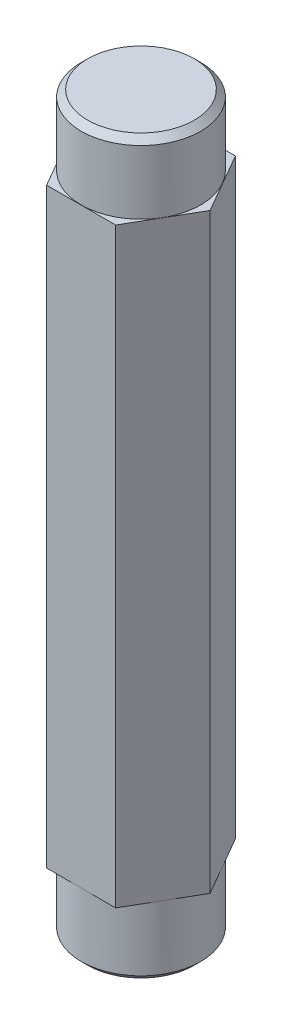
ISO-10303-21;
HEADER;
FILE_DESCRIPTION(('STEP AP214'),'2;1');
FILE_NAME('part.step','',(''),(''),'','','');
FILE_SCHEMA(('AUTOMOTIVE_DESIGN { 1 0 10303 214 1 1 1 1 }'));
ENDSEC;
DATA;
#1=APPLICATION_CONTEXT('core data for automotive mechanical design processes');
#2=APPLICATION_PROTOCOL_DEFINITION('international standard','automotive_design',2000,#1);
#3=PRODUCT_CONTEXT('',#1,'mechanical');
#4=PRODUCT('Part','Part','',(#3));
#5=PRODUCT_RELATED_PRODUCT_CATEGORY('part','',(#4));
#6=PRODUCT_DEFINITION_FORMATION('','',#4);
#7=PRODUCT_DEFINITION_CONTEXT('part definition',#1,'design');
#8=PRODUCT_DEFINITION('design','',#6,#7);
#9=PRODUCT_DEFINITION_SHAPE('','',#8);
#10=(LENGTH_UNIT() NAMED_UNIT(*) SI_UNIT(.MILLI.,.METRE.));
#11=(NAMED_UNIT(*) PLANE_ANGLE_UNIT() SI_UNIT($,.RADIAN.));
#12=(NAMED_UNIT(*) SI_UNIT($,.STERADIAN.) SOLID_ANGLE_UNIT());
#13=UNCERTAINTY_MEASURE_WITH_UNIT(LENGTH_MEASURE(1.E-05),#10,'distance_accuracy_value','');
#14=(GEOMETRIC_REPRESENTATION_CONTEXT(3) GLOBAL_UNCERTAINTY_ASSIGNED_CONTEXT((#13)) GLOBAL_UNIT_ASSIGNED_CONTEXT((#10,
#11,#12)) REPRESENTATION_CONTEXT('',''));
#15=CARTESIAN_POINT('',(0.,0.,0.));
#16=DIRECTION('',(0.,0.,1.));
#17=DIRECTION('',(1.,0.,0.));
#18=AXIS2_PLACEMENT_3D('',#15,#16,#17);
#19=CARTESIAN_POINT('',(-39.2241243202131,5.588,-16.6661167863655));
#20=DIRECTION('',(0.,-1.,0.));
#21=DIRECTION('',(0.,0.,-1.));
#22=AXIS2_PLACEMENT_3D('',#19,#20,#21);
#23=PLANE('',#22);
#24=CARTESIAN_POINT('',(-39.2241243202131,5.58799999998882,-16.6661167863655));
#25=DIRECTION('',(0.,-1.,0.));
#26=DIRECTION('',(0.,0.,-1.));
#27=AXIS2_PLACEMENT_3D('',#24,#25,#26);
#28=CIRCLE('',#27,4.24180000006195);
#29=CARTESIAN_POINT('',(-39.2241243202131,5.58799999998882,-20.9079167864274));
#30=VERTEX_POINT('',#29);
#31=EDGE_CURVE('E19',#30,#30,#28,.T.);
#32=ORIENTED_EDGE('',*,*,#31,.F.);
#33=EDGE_LOOP('',(#32));
#34=FACE_BOUND('',#33,.T.);
#35=ADVANCED_FACE('F16',(#34),#23,.F.);
#36=CARTESIAN_POINT('',(-39.2241243202131,-52.6542,-16.6661167863655));
#37=DIRECTION('',(0.,1.,0.));
#38=DIRECTION('',(0.,0.,1.));
#39=AXIS2_PLACEMENT_3D('',#36,#37,#38);
#40=PLANE('',#39);
#41=CARTESIAN_POINT('',(-39.2241243202131,-52.6542000000632,-16.6661167863655));
#42=DIRECTION('',(0.,1.,0.));
#43=DIRECTION('',(0.,0.,1.));
#44=AXIS2_PLACEMENT_3D('',#41,#42,#43);
#45=CIRCLE('',#44,4.24179999997172);
#46=CARTESIAN_POINT('',(-39.2241243202131,-52.6542000000632,-12.4243167863938));
#47=VERTEX_POINT('',#46);
#48=EDGE_CURVE('E106',#47,#47,#45,.T.);
#49=ORIENTED_EDGE('',*,*,#48,.F.);
#50=EDGE_LOOP('',(#49));
#51=FACE_BOUND('',#50,.T.);
#52=ADVANCED_FACE('F123',(#51),#40,.F.);
#53=CARTESIAN_POINT('',(-39.2241243202131,5.08000000002085,-16.6661167863655));
#54=DIRECTION('',(0.,-1.,0.));
#55=DIRECTION('',(0.,0.,-1.));
#56=AXIS2_PLACEMENT_3D('',#53,#54,#55);
#57=CONICAL_SURFACE('',#56,4.74980000002993,0.785398163397448);
#58=CARTESIAN_POINT('',(-39.2241243202131,5.08,-16.6661167863655));
#59=DIRECTION('',(0.,1.,0.));
#60=DIRECTION('',(0.,0.,1.));
#61=AXIS2_PLACEMENT_3D('',#58,#59,#60);
#62=CIRCLE('',#61,4.7498);
#63=CARTESIAN_POINT('',(-39.2241243202131,5.08,-11.9163167863655));
#64=VERTEX_POINT('',#63);
#65=EDGE_CURVE('E101',#64,#64,#62,.F.);
#66=ORIENTED_EDGE('',*,*,#65,.F.);
#67=EDGE_LOOP('',(#66));
#68=FACE_BOUND('',#67,.T.);
#69=ORIENTED_EDGE('',*,*,#31,.T.);
#70=EDGE_LOOP('',(#69));
#71=FACE_BOUND('',#70,.T.);
#72=ADVANCED_FACE('F120',(#68,#71),#57,.T.);
#73=CARTESIAN_POINT('',(-39.2241243202131,-52.1461999999815,-16.6661167863655));
#74=DIRECTION('',(0.,1.,0.));
#75=DIRECTION('',(0.,0.,1.));
#76=AXIS2_PLACEMENT_3D('',#73,#74,#75);
#77=CONICAL_SURFACE('',#76,4.74980000005339,0.785398163397448);
#78=CARTESIAN_POINT('',(-39.2241243202131,-52.1462,-16.6661167863655));
#79=DIRECTION('',(0.,-1.,0.));
#80=DIRECTION('',(0.,0.,-1.));
#81=AXIS2_PLACEMENT_3D('',#78,#79,#80);
#82=CIRCLE('',#81,4.7498);
#83=CARTESIAN_POINT('',(-39.2241243202131,-52.1462,-21.4159167863655));
#84=VERTEX_POINT('',#83);
#85=EDGE_CURVE('E86',#84,#84,#82,.F.);
#86=ORIENTED_EDGE('',*,*,#85,.F.);
#87=EDGE_LOOP('',(#86));
#88=FACE_BOUND('',#87,.T.);
#89=ORIENTED_EDGE('',*,*,#48,.T.);
#90=EDGE_LOOP('',(#89));
#91=FACE_BOUND('',#90,.T.);
#92=ADVANCED_FACE('F165',(#88,#91),#77,.T.);
#93=CARTESIAN_POINT('',(-39.2241243202131,5.588,-16.6661167863655));
#94=DIRECTION('',(0.,1.,0.));
#95=DIRECTION('',(0.,0.,1.));
#96=AXIS2_PLACEMENT_3D('',#93,#94,#95);
#97=CYLINDRICAL_SURFACE('',#96,4.7498);
#98=CARTESIAN_POINT('',(-39.2241243202131,0.,-16.6661167863655));
#99=DIRECTION('',(0.,1.,0.));
#100=DIRECTION('',(0.,0.,1.));
#101=AXIS2_PLACEMENT_3D('',#98,#99,#100);
#102=CIRCLE('',#101,4.7498);
#103=CARTESIAN_POINT('',(-39.2241243202131,0.,-11.9163167863655));
#104=VERTEX_POINT('',#103);
#105=EDGE_CURVE('E79',#104,#104,#102,.T.);
#106=ORIENTED_EDGE('',*,*,#105,.T.);
#107=EDGE_LOOP('',(#106));
#108=FACE_BOUND('',#107,.T.);
#109=ORIENTED_EDGE('',*,*,#65,.T.);
#110=EDGE_LOOP('',(#109));
#111=FACE_BOUND('',#110,.T.);
#112=ADVANCED_FACE('F161',(#108,#111),#97,.T.);
#113=CARTESIAN_POINT('',(-39.2241243202131,-52.6542,-16.6661167863655));
#114=DIRECTION('',(0.,-1.,0.));
#115=DIRECTION('',(0.,0.,-1.));
#116=AXIS2_PLACEMENT_3D('',#113,#114,#115);
#117=CYLINDRICAL_SURFACE('',#116,4.7498);
#118=CARTESIAN_POINT('',(-39.2241243202131,-47.0662,-16.6661167863655));
#119=DIRECTION('',(0.,-1.,0.));
#120=DIRECTION('',(0.,0.,-1.));
#121=AXIS2_PLACEMENT_3D('',#118,#119,#120);
#122=CIRCLE('',#121,4.7498);
#123=CARTESIAN_POINT('',(-39.2241243202131,-47.0662,-21.4159167863655));
#124=VERTEX_POINT('',#123);
#125=EDGE_CURVE('E109',#124,#124,#122,.F.);
#126=ORIENTED_EDGE('',*,*,#125,.F.);
#127=EDGE_LOOP('',(#126));
#128=FACE_BOUND('',#127,.T.);
#129=ORIENTED_EDGE('',*,*,#85,.T.);
#130=EDGE_LOOP('',(#129));
#131=FACE_BOUND('',#130,.T.);
#132=ADVANCED_FACE('F158',(#128,#131),#117,.T.);
#133=CARTESIAN_POINT('',(-41.9737549772287,-47.0662,-21.4286167863655));
#134=DIRECTION('',(-0.866025403784438,0.,-0.500000000000001));
#135=DIRECTION('',(-0.500000000000001,0.,0.866025403784438));
#136=AXIS2_PLACEMENT_3D('',#133,#134,#135);
#137=PLANE('',#136);
#138=DIRECTION('',(0.500000000000001,0.,-0.866025403784438));
#139=VECTOR('',#138,1.);
#140=CARTESIAN_POINT('',(-44.7233856342443,-47.0662,-16.6661167863655));
#141=LINE('',#140,#139);
#142=CARTESIAN_POINT('',(-44.7233856342443,-47.0662,-16.6661167863655));
#143=VERTEX_POINT('',#142);
#144=CARTESIAN_POINT('',(-41.9737549772287,-47.0662,-21.4286167863655));
#145=VERTEX_POINT('',#144);
#146=EDGE_CURVE('E244',#143,#145,#141,.T.);
#147=ORIENTED_EDGE('',*,*,#146,.F.);
#148=DIRECTION('',(0.,1.,0.));
#149=VECTOR('',#148,1.);
#150=CARTESIAN_POINT('',(-44.7233856342443,-47.0662,-16.6661167863655));
#151=LINE('',#150,#149);
#152=CARTESIAN_POINT('',(-44.7233856342443,0.,-16.6661167863655));
#153=VERTEX_POINT('',#152);
#154=EDGE_CURVE('E76',#153,#143,#151,.F.);
#155=ORIENTED_EDGE('',*,*,#154,.F.);
#156=DIRECTION('',(0.500000000000001,0.,-0.866025403784438));
#157=VECTOR('',#156,1.);
#158=CARTESIAN_POINT('',(-44.7233856342443,0.,-16.6661167863655));
#159=LINE('',#158,#157);
#160=CARTESIAN_POINT('',(-41.9737549772287,0.,-21.4286167863655));
#161=VERTEX_POINT('',#160);
#162=EDGE_CURVE('E71',#153,#161,#159,.T.);
#163=ORIENTED_EDGE('',*,*,#162,.T.);
#164=DIRECTION('',(0.,1.,0.));
#165=VECTOR('',#164,1.);
#166=CARTESIAN_POINT('',(-41.9737549772287,-47.0662,-21.4286167863655));
#167=LINE('',#166,#165);
#168=EDGE_CURVE('E74',#145,#161,#167,.T.);
#169=ORIENTED_EDGE('',*,*,#168,.F.);
#170=EDGE_LOOP('',(#147,#155,#163,#169));
#171=FACE_BOUND('',#170,.T.);
#172=ADVANCED_FACE('F73',(#171),#137,.T.);
#173=CARTESIAN_POINT('',(-36.4744936631975,-47.0662,-21.4286167863655));
#174=DIRECTION('',(0.,0.,-1.));
#175=DIRECTION('',(-1.,0.,0.));
#176=AXIS2_PLACEMENT_3D('',#173,#174,#175);
#177=PLANE('',#176);
#178=DIRECTION('',(1.,0.,0.));
#179=VECTOR('',#178,1.);
#180=CARTESIAN_POINT('',(-44.7233856342443,-47.0662,-21.4286167863655));
#181=LINE('',#180,#179);
#182=CARTESIAN_POINT('',(-36.4744936631975,-47.0662,-21.4286167863655));
#183=VERTEX_POINT('',#182);
#184=EDGE_CURVE('E83',#145,#183,#181,.T.);
#185=ORIENTED_EDGE('',*,*,#184,.F.);
#186=ORIENTED_EDGE('',*,*,#168,.T.);
#187=DIRECTION('',(1.,0.,0.));
#188=VECTOR('',#187,1.);
#189=CARTESIAN_POINT('',(-44.7233856342443,0.,-21.4286167863655));
#190=LINE('',#189,#188);
#191=CARTESIAN_POINT('',(-36.4744936631975,0.,-21.4286167863655));
#192=VERTEX_POINT('',#191);
#193=EDGE_CURVE('E66',#161,#192,#190,.T.);
#194=ORIENTED_EDGE('',*,*,#193,.T.);
#195=DIRECTION('',(0.,1.,0.));
#196=VECTOR('',#195,1.);
#197=CARTESIAN_POINT('',(-36.4744936631975,-47.0662,-21.4286167863655));
#198=LINE('',#197,#196);
#199=EDGE_CURVE('E85',#183,#192,#198,.T.);
#200=ORIENTED_EDGE('',*,*,#199,.F.);
#201=EDGE_LOOP('',(#185,#186,#194,#200));
#202=FACE_BOUND('',#201,.T.);
#203=ADVANCED_FACE('F81',(#202),#177,.T.);
#204=CARTESIAN_POINT('',(-33.7248630061819,-47.0662,-16.6661167863655));
#205=DIRECTION('',(0.866025403784439,0.,-0.5));
#206=DIRECTION('',(-0.5,0.,-0.866025403784439));
#207=AXIS2_PLACEMENT_3D('',#204,#205,#206);
#208=PLANE('',#207);
#209=DIRECTION('',(0.500000000000002,0.,0.866025403784438));
#210=VECTOR('',#209,1.);
#211=CARTESIAN_POINT('',(-36.4744936631975,-47.0662,-21.4286167863655));
#212=LINE('',#211,#210);
#213=CARTESIAN_POINT('',(-33.7248630061819,-47.0662,-16.6661167863655));
#214=VERTEX_POINT('',#213);
#215=EDGE_CURVE('E238',#183,#214,#212,.T.);
#216=ORIENTED_EDGE('',*,*,#215,.F.);
#217=ORIENTED_EDGE('',*,*,#199,.T.);
#218=DIRECTION('',(0.500000000000002,0.,0.866025403784438));
#219=VECTOR('',#218,1.);
#220=CARTESIAN_POINT('',(-36.4744936631975,0.,-21.4286167863655));
#221=LINE('',#220,#219);
#222=CARTESIAN_POINT('',(-33.7248630061819,0.,-16.6661167863655));
#223=VERTEX_POINT('',#222);
#224=EDGE_CURVE('E92',#192,#223,#221,.T.);
#225=ORIENTED_EDGE('',*,*,#224,.T.);
#226=DIRECTION('',(0.,1.,0.));
#227=VECTOR('',#226,1.);
#228=CARTESIAN_POINT('',(-33.7248630061819,-47.0662,-16.6661167863655));
#229=LINE('',#228,#227);
#230=EDGE_CURVE('E240',#214,#223,#229,.T.);
#231=ORIENTED_EDGE('',*,*,#230,.F.);
#232=EDGE_LOOP('',(#216,#217,#225,#231));
#233=FACE_BOUND('',#232,.T.);
#234=ADVANCED_FACE('F150',(#233),#208,.T.);
#235=CARTESIAN_POINT('',(-44.7233856342443,0.,-16.6661167863655));
#236=DIRECTION('',(0.,-1.,0.));
#237=DIRECTION('',(0.,0.,-1.));
#238=AXIS2_PLACEMENT_3D('',#235,#236,#237);
#239=PLANE('',#238);
#240=DIRECTION('',(1.,0.,0.));
#241=VECTOR('',#240,1.);
#242=CARTESIAN_POINT('',(-41.9737549772287,0.,-11.9036167863655));
#243=LINE('',#242,#241);
#244=CARTESIAN_POINT('',(-36.4744936631975,0.,-11.9036167863655));
#245=VERTEX_POINT('',#244);
#246=CARTESIAN_POINT('',(-41.9737549772287,0.,-11.9036167863655));
#247=VERTEX_POINT('',#246);
#248=EDGE_CURVE('E254',#245,#247,#243,.F.);
#249=ORIENTED_EDGE('',*,*,#248,.F.);
#250=DIRECTION('',(0.500000000000001,0.,-0.866025403784438));
#251=VECTOR('',#250,1.);
#252=CARTESIAN_POINT('',(-36.4744936631975,0.,-11.9036167863655));
#253=LINE('',#252,#251);
#254=EDGE_CURVE('E241',#223,#245,#253,.F.);
#255=ORIENTED_EDGE('',*,*,#254,.F.);
#256=ORIENTED_EDGE('',*,*,#224,.F.);
#257=ORIENTED_EDGE('',*,*,#193,.F.);
#258=ORIENTED_EDGE('',*,*,#162,.F.);
#259=DIRECTION('',(0.5,0.,0.866025403784439));
#260=VECTOR('',#259,1.);
#261=CARTESIAN_POINT('',(-44.7233856342443,0.,-16.6661167863655));
#262=LINE('',#261,#260);
#263=EDGE_CURVE('E94',#247,#153,#262,.F.);
#264=ORIENTED_EDGE('',*,*,#263,.F.);
#265=EDGE_LOOP('',(#249,#255,#256,#257,#258,#264));
#266=FACE_BOUND('',#265,.T.);
#267=ORIENTED_EDGE('',*,*,#105,.F.);
#268=EDGE_LOOP('',(#267));
#269=FACE_BOUND('',#268,.T.);
#270=ADVANCED_FACE('F89',(#266,#269),#239,.F.);
#271=CARTESIAN_POINT('',(-44.7233856342443,-47.0662,-16.6661167863655));
#272=DIRECTION('',(-0.866025403784439,0.,0.5));
#273=DIRECTION('',(0.5,0.,0.866025403784439));
#274=AXIS2_PLACEMENT_3D('',#271,#272,#273);
#275=PLANE('',#274);
#276=DIRECTION('',(-0.500000000000001,0.,-0.866025403784438));
#277=VECTOR('',#276,1.);
#278=CARTESIAN_POINT('',(-41.9737549772287,-47.0662,-11.9036167863655));
#279=LINE('',#278,#277);
#280=CARTESIAN_POINT('',(-41.9737549772287,-47.0662,-11.9036167863655));
#281=VERTEX_POINT('',#280);
#282=EDGE_CURVE('E112',#281,#143,#279,.T.);
#283=ORIENTED_EDGE('',*,*,#282,.F.);
#284=DIRECTION('',(0.,1.,0.));
#285=VECTOR('',#284,1.);
#286=CARTESIAN_POINT('',(-41.9737549772287,-47.0662,-11.9036167863655));
#287=LINE('',#286,#285);
#288=EDGE_CURVE('E252',#247,#281,#287,.F.);
#289=ORIENTED_EDGE('',*,*,#288,.F.);
#290=ORIENTED_EDGE('',*,*,#263,.T.);
#291=ORIENTED_EDGE('',*,*,#154,.T.);
#292=EDGE_LOOP('',(#283,#289,#290,#291));
#293=FACE_BOUND('',#292,.T.);
#294=ADVANCED_FACE('F144',(#293),#275,.T.);
#295=CARTESIAN_POINT('',(-44.7233856342443,-47.0662,-16.6661167863655));
#296=DIRECTION('',(0.,-1.,0.));
#297=DIRECTION('',(0.,0.,-1.));
#298=AXIS2_PLACEMENT_3D('',#295,#296,#297);
#299=PLANE('',#298);
#300=DIRECTION('',(0.500000000000001,0.,-0.866025403784438));
#301=VECTOR('',#300,1.);
#302=CARTESIAN_POINT('',(-36.4744936631975,-47.0662,-11.9036167863655));
#303=LINE('',#302,#301);
#304=CARTESIAN_POINT('',(-36.4744936631975,-47.0662,-11.9036167863655));
#305=VERTEX_POINT('',#304);
#306=EDGE_CURVE('E34',#305,#214,#303,.T.);
#307=ORIENTED_EDGE('',*,*,#306,.F.);
#308=DIRECTION('',(1.,0.,0.));
#309=VECTOR('',#308,1.);
#310=CARTESIAN_POINT('',(-41.9737549772287,-47.0662,-11.9036167863655));
#311=LINE('',#310,#309);
#312=EDGE_CURVE('E25',#281,#305,#311,.T.);
#313=ORIENTED_EDGE('',*,*,#312,.F.);
#314=ORIENTED_EDGE('',*,*,#282,.T.);
#315=ORIENTED_EDGE('',*,*,#146,.T.);
#316=ORIENTED_EDGE('',*,*,#184,.T.);
#317=ORIENTED_EDGE('',*,*,#215,.T.);
#318=EDGE_LOOP('',(#307,#313,#314,#315,#316,#317));
#319=FACE_BOUND('',#318,.T.);
#320=ORIENTED_EDGE('',*,*,#125,.T.);
#321=EDGE_LOOP('',(#320));
#322=FACE_BOUND('',#321,.T.);
#323=ADVANCED_FACE('F137',(#319,#322),#299,.T.);
#324=CARTESIAN_POINT('',(-36.4744936631975,-47.0662,-11.9036167863655));
#325=DIRECTION('',(0.866025403784438,0.,0.500000000000001));
#326=DIRECTION('',(0.500000000000001,0.,-0.866025403784438));
#327=AXIS2_PLACEMENT_3D('',#324,#325,#326);
#328=PLANE('',#327);
#329=ORIENTED_EDGE('',*,*,#306,.T.);
#330=ORIENTED_EDGE('',*,*,#230,.T.);
#331=ORIENTED_EDGE('',*,*,#254,.T.);
#332=DIRECTION('',(0.,1.,0.));
#333=VECTOR('',#332,1.);
#334=CARTESIAN_POINT('',(-36.4744936631975,-47.0662,-11.9036167863655));
#335=LINE('',#334,#333);
#336=EDGE_CURVE('E11',#305,#245,#335,.T.);
#337=ORIENTED_EDGE('',*,*,#336,.F.);
#338=EDGE_LOOP('',(#329,#330,#331,#337));
#339=FACE_BOUND('',#338,.T.);
#340=ADVANCED_FACE('F131',(#339),#328,.T.);
#341=CARTESIAN_POINT('',(-41.9737549772287,-47.0662,-11.9036167863655));
#342=DIRECTION('',(0.,0.,1.));
#343=DIRECTION('',(1.,0.,0.));
#344=AXIS2_PLACEMENT_3D('',#341,#342,#343);
#345=PLANE('',#344);
#346=ORIENTED_EDGE('',*,*,#312,.T.);
#347=ORIENTED_EDGE('',*,*,#336,.T.);
#348=ORIENTED_EDGE('',*,*,#248,.T.);
#349=ORIENTED_EDGE('',*,*,#288,.T.);
#350=EDGE_LOOP('',(#346,#347,#348,#349));
#351=FACE_BOUND('',#350,.T.);
#352=ADVANCED_FACE('F129',(#351),#345,.T.);
#353=CLOSED_SHELL('',(#35,#52,#72,#92,#112,#132,#172,#203,#234,#270,#294,#323,#340,#352));
#354=MANIFOLD_SOLID_BREP('B1',#353);
#355=ADVANCED_BREP_SHAPE_REPRESENTATION('',(#18,#354),#14);
#356=SHAPE_DEFINITION_REPRESENTATION(#9,#355);
ENDSEC;
END-ISO-10303-21;
